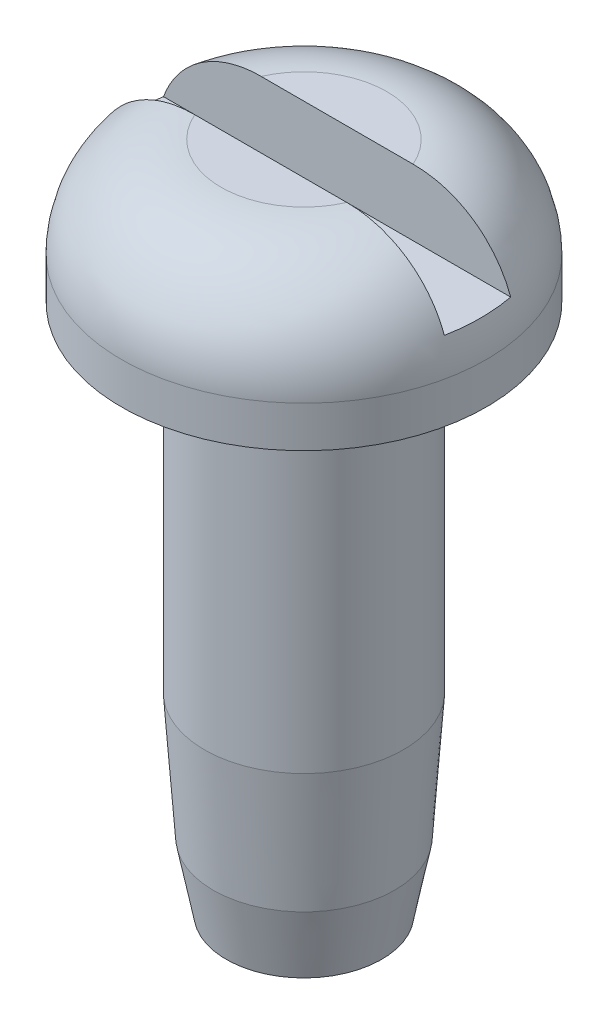
ISO-10303-21;
HEADER;
FILE_DESCRIPTION(('STEP AP214'),'2;1');
FILE_NAME('part.step','',(''),(''),'','','');
FILE_SCHEMA(('AUTOMOTIVE_DESIGN { 1 0 10303 214 1 1 1 1 }'));
ENDSEC;
DATA;
#1=APPLICATION_CONTEXT('core data for automotive mechanical design processes');
#2=APPLICATION_PROTOCOL_DEFINITION('international standard','automotive_design',2000,#1);
#3=PRODUCT_CONTEXT('',#1,'mechanical');
#4=PRODUCT('Part','Part','',(#3));
#5=PRODUCT_RELATED_PRODUCT_CATEGORY('part','',(#4));
#6=PRODUCT_DEFINITION_FORMATION('','',#4);
#7=PRODUCT_DEFINITION_CONTEXT('part definition',#1,'design');
#8=PRODUCT_DEFINITION('design','',#6,#7);
#9=PRODUCT_DEFINITION_SHAPE('','',#8);
#10=(LENGTH_UNIT() NAMED_UNIT(*) SI_UNIT(.MILLI.,.METRE.));
#11=(NAMED_UNIT(*) PLANE_ANGLE_UNIT() SI_UNIT($,.RADIAN.));
#12=(NAMED_UNIT(*) SI_UNIT($,.STERADIAN.) SOLID_ANGLE_UNIT());
#13=UNCERTAINTY_MEASURE_WITH_UNIT(LENGTH_MEASURE(1.E-05),#10,'distance_accuracy_value','');
#14=(GEOMETRIC_REPRESENTATION_CONTEXT(3) GLOBAL_UNCERTAINTY_ASSIGNED_CONTEXT((#13)) GLOBAL_UNIT_ASSIGNED_CONTEXT((#10,
#11,#12)) REPRESENTATION_CONTEXT('',''));
#15=CARTESIAN_POINT('',(0.,0.,0.));
#16=DIRECTION('',(0.,0.,1.));
#17=DIRECTION('',(1.,0.,0.));
#18=AXIS2_PLACEMENT_3D('',#15,#16,#17);
#19=CARTESIAN_POINT('',(0.,10.12,0.));
#20=DIRECTION('',(0.,1.,0.));
#21=DIRECTION('',(0.,0.,1.));
#22=AXIS2_PLACEMENT_3D('',#19,#20,#21);
#23=PLANE('',#22);
#24=DIRECTION('',(1.,0.,0.));
#25=VECTOR('',#24,1.);
#26=CARTESIAN_POINT('',(-5.,10.12,0.5));
#27=LINE('',#26,#25);
#28=CARTESIAN_POINT('',(-1.14564392373896,10.12,0.5));
#29=VERTEX_POINT('',#28);
#30=CARTESIAN_POINT('',(1.14564392373896,10.12,0.5));
#31=VERTEX_POINT('',#30);
#32=EDGE_CURVE('E55',#29,#31,#27,.T.);
#33=ORIENTED_EDGE('',*,*,#32,.F.);
#34=CARTESIAN_POINT('',(0.,10.12,0.));
#35=DIRECTION('',(0.,-1.,0.));
#36=DIRECTION('',(0.,0.,-1.));
#37=AXIS2_PLACEMENT_3D('',#34,#35,#36);
#38=CIRCLE('',#37,1.25);
#39=EDGE_CURVE('E89',#31,#29,#38,.T.);
#40=ORIENTED_EDGE('',*,*,#39,.F.);
#41=EDGE_LOOP('',(#33,#40));
#42=FACE_BOUND('',#41,.T.);
#43=ADVANCED_FACE('F29',(#42),#23,.T.);
#44=CARTESIAN_POINT('',(1.17275874816961,0.,0.));
#45=DIRECTION('',(0.,-1.,0.));
#46=DIRECTION('',(0.,0.,-1.));
#47=AXIS2_PLACEMENT_3D('',#44,#45,#46);
#48=PLANE('',#47);
#49=CARTESIAN_POINT('',(0.,0.,0.));
#50=DIRECTION('',(0.,-1.,0.));
#51=DIRECTION('',(0.,0.,-1.));
#52=AXIS2_PLACEMENT_3D('',#49,#50,#51);
#53=CIRCLE('',#52,1.17275874816961);
#54=CARTESIAN_POINT('',(0.,0.,-1.17275874816961));
#55=VERTEX_POINT('',#54);
#56=EDGE_CURVE('E153',#55,#55,#53,.T.);
#57=ORIENTED_EDGE('',*,*,#56,.T.);
#58=EDGE_LOOP('',(#57));
#59=FACE_BOUND('',#58,.T.);
#60=ADVANCED_FACE('F31',(#59),#48,.T.);
#61=DIRECTION('',(1.,0.,0.));
#62=VECTOR('',#61,1.);
#63=CARTESIAN_POINT('',(-5.,10.12,-0.5));
#64=LINE('',#63,#62);
#65=CARTESIAN_POINT('',(-1.14564392373894,10.12,-0.5));
#66=VERTEX_POINT('',#65);
#67=CARTESIAN_POINT('',(1.14564392373896,10.12,-0.5));
#68=VERTEX_POINT('',#67);
#69=EDGE_CURVE('E147',#66,#68,#64,.T.);
#70=ORIENTED_EDGE('',*,*,#69,.T.);
#71=EDGE_CURVE('E91',#66,#68,#38,.T.);
#72=ORIENTED_EDGE('',*,*,#71,.F.);
#73=EDGE_LOOP('',(#70,#72));
#74=FACE_BOUND('',#73,.T.);
#75=ADVANCED_FACE('F134',(#74),#23,.T.);
#76=CARTESIAN_POINT('',(0.,8.62,0.));
#77=DIRECTION('',(0.,-1.,0.));
#78=DIRECTION('',(0.,0.,-1.));
#79=AXIS2_PLACEMENT_3D('',#76,#77,#78);
#80=DEGENERATE_TOROIDAL_SURFACE('',#79,1.25,1.5,.T.);
#81=CARTESIAN_POINT('',(0.,9.91903810567666,0.5));
#82=CARTESIAN_POINT('',(0.0197737967426219,9.91903699051281,0.5));
#83=CARTESIAN_POINT('',(0.039545997070024,9.91972097422772,0.5));
#84=CARTESIAN_POINT('',(0.0790049364274311,9.92238565184631,0.5));
#85=CARTESIAN_POINT('',(0.0986916568827287,9.92436661465185,0.5));
#86=CARTESIAN_POINT('',(0.157658806665077,9.93201772190164,0.5));
#87=CARTESIAN_POINT('',(0.196712342215652,9.93939416178655,0.5));
#88=CARTESIAN_POINT('',(0.275124136138794,9.95691867254126,0.5));
#89=CARTESIAN_POINT('',(0.314466933281958,9.96712944240033,0.5));
#90=CARTESIAN_POINT('',(0.39287139062671,9.98839358731296,0.5));
#91=CARTESIAN_POINT('',(0.431933305028928,9.99944605597856,0.5));
#92=CARTESIAN_POINT('',(0.501301872096742,10.0187136890993,0.5));
#93=CARTESIAN_POINT('',(0.531587016560786,10.0270043381932,0.5));
#94=CARTESIAN_POINT('',(0.59231873710385,10.0429681170111,0.5));
#95=CARTESIAN_POINT('',(0.622765307602736,10.0506412679342,0.5));
#96=CARTESIAN_POINT('',(0.714444507837876,10.072268731735,0.5));
#97=CARTESIAN_POINT('',(0.77602264255314,10.0848328671731,0.5));
#98=CARTESIAN_POINT('',(0.899211926418849,10.1045063690872,0.5));
#99=CARTESIAN_POINT('',(0.960811009545612,10.1116882742655,0.5));
#100=CARTESIAN_POINT('',(1.08441181623602,10.119982708445,0.5));
#101=CARTESIAN_POINT('',(1.14641345705493,10.1210964475224,0.5));
#102=CARTESIAN_POINT('',(1.29839149729664,10.1156808031107,0.5));
#103=CARTESIAN_POINT('',(1.38827496423116,10.1054476264636,0.5));
#104=CARTESIAN_POINT('',(1.5655160441354,10.0701085255421,0.5));
#105=CARTESIAN_POINT('',(1.65286037456457,10.0449354557139,0.5));
#106=CARTESIAN_POINT('',(1.82201022944715,9.97980320122016,0.5));
#107=CARTESIAN_POINT('',(1.90380863536467,9.93982542352841,0.5));
#108=CARTESIAN_POINT('',(2.05893063453845,9.84606037380876,0.5));
#109=CARTESIAN_POINT('',(2.13226621782682,9.79229299585723,0.5));
#110=CARTESIAN_POINT('',(2.26478412131533,9.67539956584984,0.5));
#111=CARTESIAN_POINT('',(2.32448197727165,9.61285721966374,0.5));
#112=CARTESIAN_POINT('',(2.43222659686663,9.47840118755471,0.5));
#113=CARTESIAN_POINT('',(2.48027148226754,9.40648599377457,0.5));
#114=CARTESIAN_POINT('',(2.56214623761733,9.25728685626811,0.5));
#115=CARTESIAN_POINT('',(2.59629751819339,9.18017910279185,0.5));
#116=CARTESIAN_POINT('',(2.6510201495019,9.02129400062946,0.5));
#117=CARTESIAN_POINT('',(2.67159356246283,8.93951736311187,0.5));
#118=CARTESIAN_POINT('',(2.69840777421314,8.77448124410096,0.5));
#119=CARTESIAN_POINT('',(2.70478844563198,8.69124445683348,0.5));
#120=CARTESIAN_POINT('',(2.70344187908911,8.52488375286552,0.5));
#121=CARTESIAN_POINT('',(2.69571462174529,8.44175983632027,0.5));
#122=CARTESIAN_POINT('',(2.6664238938936,8.2782303265959,0.5));
#123=CARTESIAN_POINT('',(2.64489941267322,8.19781774341545,0.5));
#124=CARTESIAN_POINT('',(2.58868989599857,8.04173685310368,0.5));
#125=CARTESIAN_POINT('',(2.55400522221295,7.96606841566025,0.5));
#126=CARTESIAN_POINT('',(2.47239136730437,7.82139313741305,0.5));
#127=CARTESIAN_POINT('',(2.42543044004134,7.75240421302385,0.5));
#128=CARTESIAN_POINT('',(2.32068991297136,7.62320055409526,0.5));
#129=CARTESIAN_POINT('',(2.26290986909631,7.56298617988569,0.5));
#130=CARTESIAN_POINT('',(2.1376383937126,7.4524066505661,0.5));
#131=CARTESIAN_POINT('',(2.07006224255004,7.4021375411874,0.5));
#132=CARTESIAN_POINT('',(1.92756642032558,7.31338415072852,0.5));
#133=CARTESIAN_POINT('',(1.85264537322231,7.2749020835018,0.5));
#134=CARTESIAN_POINT('',(1.69586550119496,7.20979556853511,0.5));
#135=CARTESIAN_POINT('',(1.61388894691269,7.18345572003334,0.5));
#136=CARTESIAN_POINT('',(1.44689684836527,7.14422598061919,0.5));
#137=CARTESIAN_POINT('',(1.36188552335867,7.13131811481953,0.5));
#138=CARTESIAN_POINT('',(1.23157222453163,7.12149658917173,0.5));
#139=CARTESIAN_POINT('',(1.18656268644896,7.1199004182258,0.5));
#140=CARTESIAN_POINT('',(1.09652167613938,7.12010899856503,0.5));
#141=CARTESIAN_POINT('',(1.05149020479393,7.12191553458151,0.5));
#142=CARTESIAN_POINT('',(0.961325647015333,7.12872615390305,0.5));
#143=CARTESIAN_POINT('',(0.91619450842239,7.13375507198137,0.5));
#144=CARTESIAN_POINT('',(0.826423033823089,7.14667162268328,0.5));
#145=CARTESIAN_POINT('',(0.781782036842491,7.15455474106898,0.5));
#146=CARTESIAN_POINT('',(0.704511960096931,7.1703213912584,0.5));
#147=CARTESIAN_POINT('',(0.671771535042426,7.17767410717229,0.5));
#148=CARTESIAN_POINT('',(0.606531309085661,7.19338310482878,0.5));
#149=CARTESIAN_POINT('',(0.574031532385124,7.20173948609176,0.5));
#150=CARTESIAN_POINT('',(0.509026602822168,7.21911881844639,0.5));
#151=CARTESIAN_POINT('',(0.476522363264104,7.22814511639375,0.5));
#152=CARTESIAN_POINT('',(0.411540765901529,7.24628508113241,0.5));
#153=CARTESIAN_POINT('',(0.379063406725101,7.25539874312239,0.5));
#154=CARTESIAN_POINT('',(0.314811102196065,7.27271929870446,0.5));
#155=CARTESIAN_POINT('',(0.283041154127009,7.2809441425563,0.5));
#156=CARTESIAN_POINT('',(0.219122271479169,7.29581576847306,0.5));
#157=CARTESIAN_POINT('',(0.186973413174861,7.3024628626301,0.5));
#158=CARTESIAN_POINT('',(0.122535986915505,7.31299574174243,0.5));
#159=CARTESIAN_POINT('',(0.0902522633560652,7.31690924568899,0.5));
#160=CARTESIAN_POINT('',(0.0254565220278628,7.3211738697098,0.5));
#161=CARTESIAN_POINT('',(-0.00705527487153956,7.32152805879707,0.5));
#162=CARTESIAN_POINT('',(-0.0641114600706277,7.31895294789521,0.5));
#163=CARTESIAN_POINT('',(-0.0886952199397869,7.3167913357537,0.5));
#164=CARTESIAN_POINT('',(-0.1376461288443,7.31069149052012,0.5));
#165=CARTESIAN_POINT('',(-0.162013161098763,7.30675235253672,0.5));
#166=CARTESIAN_POINT('',(-0.210680764188104,7.29751931696451,0.5));
#167=CARTESIAN_POINT('',(-0.234979261882854,7.29221488458718,0.5));
#168=CARTESIAN_POINT('',(-0.283365005670842,7.28074448060725,0.5));
#169=CARTESIAN_POINT('',(-0.307452266115815,7.2745785680243,0.5));
#170=CARTESIAN_POINT('',(-0.380779475434894,7.25510624869801,0.5));
#171=CARTESIAN_POINT('',(-0.429830363167437,7.2411101050747,0.5));
#172=CARTESIAN_POINT('',(-0.527981941469721,7.21390980279642,0.5));
#173=CARTESIAN_POINT('',(-0.57708193114663,7.20070317855707,0.5));
#174=CARTESIAN_POINT('',(-0.675177152279307,7.1766798462992,0.5));
#175=CARTESIAN_POINT('',(-0.724164766426272,7.16583314340996,0.5));
#176=CARTESIAN_POINT('',(-0.822717908206681,7.14722410901175,0.5));
#177=CARTESIAN_POINT('',(-0.872283220881641,7.13946066572114,0.5));
#178=CARTESIAN_POINT('',(-0.971461809580802,7.12766653719701,0.5));
#179=CARTESIAN_POINT('',(-1.0210714167357,7.12360600589815,0.5));
#180=CARTESIAN_POINT('',(-1.12043682002785,7.1195016985067,0.5));
#181=CARTESIAN_POINT('',(-1.17019256864058,7.11945673596021,0.5));
#182=CARTESIAN_POINT('',(-1.31007808547006,7.1253755312838,0.5));
#183=CARTESIAN_POINT('',(-1.40006528318003,7.13626602026124,0.5));
#184=CARTESIAN_POINT('',(-1.57714690188035,7.17294138560288,0.5));
#185=CARTESIAN_POINT('',(-1.66423528139452,7.1987555318006,0.5));
#186=CARTESIAN_POINT('',(-1.83282513983102,7.26514806806966,0.5));
#187=CARTESIAN_POINT('',(-1.91431523553662,7.30575554004196,0.5));
#188=CARTESIAN_POINT('',(-2.0687843392629,7.40077311982285,0.5));
#189=CARTESIAN_POINT('',(-2.14176691627206,7.45517740909185,0.5));
#190=CARTESIAN_POINT('',(-2.2733629164777,7.57316004046121,0.5));
#191=CARTESIAN_POINT('',(-2.33251475259027,7.63613866059503,0.5));
#192=CARTESIAN_POINT('',(-2.43908695339319,7.77134153361864,0.5));
#193=CARTESIAN_POINT('',(-2.48650928065704,7.84356423672181,0.5));
#194=CARTESIAN_POINT('',(-2.56714602079698,7.99329987399692,0.5));
#195=CARTESIAN_POINT('',(-2.60067501661592,8.07064357513314,0.5));
#196=CARTESIAN_POINT('',(-2.65412847292476,8.22989815682363,0.5));
#197=CARTESIAN_POINT('',(-2.6740536972842,8.31180878065979,0.5));
#198=CARTESIAN_POINT('',(-2.69957055354835,8.47701492711504,0.5));
#199=CARTESIAN_POINT('',(-2.70529958425244,8.56028925853129,0.5));
#200=CARTESIAN_POINT('',(-2.70265446610113,8.72661224981365,0.5));
#201=CARTESIAN_POINT('',(-2.69428074156518,8.80966091639421,0.5));
#202=CARTESIAN_POINT('',(-2.66372171104013,8.97294378541415,0.5));
#203=CARTESIAN_POINT('',(-2.64157356642372,9.05318494886326,0.5));
#204=CARTESIAN_POINT('',(-2.58415506988989,9.20882500017115,0.5));
#205=CARTESIAN_POINT('',(-2.54888454434441,9.28422382394331,0.5));
#206=CARTESIAN_POINT('',(-2.46614594655662,9.42827883747408,0.5));
#207=CARTESIAN_POINT('',(-2.41864421566047,9.496915686834,0.5));
#208=CARTESIAN_POINT('',(-2.3128961436133,9.62532359557806,0.5));
#209=CARTESIAN_POINT('',(-2.25465066655872,9.68509536726438,0.5));
#210=CARTESIAN_POINT('',(-2.12852249718834,9.79472330200188,0.5));
#211=CARTESIAN_POINT('',(-2.06055517165249,9.84448202251315,0.5));
#212=CARTESIAN_POINT('',(-1.91734454137423,9.93218062286367,0.5));
#213=CARTESIAN_POINT('',(-1.84209723549368,9.9701139544596,0.5));
#214=CARTESIAN_POINT('',(-1.68469744675869,10.0340953760603,0.5));
#215=CARTESIAN_POINT('',(-1.60242569324102,10.059849018064,0.5));
#216=CARTESIAN_POINT('',(-1.435027547044,10.0978610722488,0.5));
#217=CARTESIAN_POINT('',(-1.34990795382501,10.1101495523996,0.5));
#218=CARTESIAN_POINT('',(-1.20921514067648,10.1197516036337,0.5));
#219=CARTESIAN_POINT('',(-1.15385942116029,10.1208284030323,0.5));
#220=CARTESIAN_POINT('',(-1.0432566354532,10.117938218697,0.5));
#221=CARTESIAN_POINT('',(-0.988009623722295,10.1139691469865,0.5));
#222=CARTESIAN_POINT('',(-0.877454898241028,10.1014296281703,0.5));
#223=CARTESIAN_POINT('',(-0.82215298947621,10.0928098832048,0.5));
#224=CARTESIAN_POINT('',(-0.7123401251258,10.0717770638322,0.5));
#225=CARTESIAN_POINT('',(-0.657828617837623,10.0593667833989,0.5));
#226=CARTESIAN_POINT('',(-0.553004651572941,10.0329701863767,0.5));
#227=CARTESIAN_POINT('',(-0.50265091655735,10.0191402275373,0.5));
#228=CARTESIAN_POINT('',(-0.401924906144861,9.99103689280184,0.5));
#229=CARTESIAN_POINT('',(-0.351552913771802,9.97676247163309,0.5));
#230=CARTESIAN_POINT('',(-0.276142022207293,9.95749613532875,0.5));
#231=CARTESIAN_POINT('',(-0.251369522605792,9.95150008685695,0.5));
#232=CARTESIAN_POINT('',(-0.201572089139234,9.94063565657851,0.5));
#233=CARTESIAN_POINT('',(-0.176547167739648,9.93576721936826,0.5));
#234=CARTESIAN_POINT('',(-0.126355625524987,9.92770226773487,0.5));
#235=CARTESIAN_POINT('',(-0.101190474849764,9.92449696460789,0.5));
#236=CARTESIAN_POINT('',(-0.0506826207314979,9.92016605140756,0.5));
#237=CARTESIAN_POINT('',(-0.0253399995280062,9.91903953475231,0.5));
#238=CARTESIAN_POINT('',(0.,9.91903810567666,0.5));
#239=B_SPLINE_CURVE_WITH_KNOTS('',3,(#81,#82,#83,#84,#85,#86,#87,#88,#89,#90,#91,#92,#93,#94,
#95,#96,#97,#98,#99,#100,#101,#102,#103,#104,#105,#106,#107,#108,#109,#110,#111,#112,#113,#114,
#115,#116,#117,#118,#119,#120,#121,#122,#123,#124,#125,#126,#127,#128,#129,#130,#131,#132,#133,
#134,#135,#136,#137,#138,#139,#140,#141,#142,#143,#144,#145,#146,#147,#148,#149,#150,#151,#152,
#153,#154,#155,#156,#157,#158,#159,#160,#161,#162,#163,#164,#165,#166,#167,#168,#169,#170,#171,
#172,#173,#174,#175,#176,#177,#178,#179,#180,#181,#182,#183,#184,#185,#186,#187,#188,#189,#190,
#191,#192,#193,#194,#195,#196,#197,#198,#199,#200,#201,#202,#203,#204,#205,#206,#207,#208,#209,
#210,#211,#212,#213,#214,#215,#216,#217,#218,#219,#220,#221,#222,#223,#224,#225,#226,#227,#228,
#229,#230,#231,#232,#233,#234,#235,#236,#237,#238),.UNSPECIFIED.,.T.,.F.,(4,2,2,2,2,2,2,2,2,2,2,
2,2,2,2,2,2,2,2,2,2,2,2,2,2,2,2,2,2,2,2,2,2,2,2,2,2,2,2,2,2,2,2,2,2,2,2,2,2,2,2,2,2,2,2,2,2,2,2,
2,2,2,2,2,2,2,2,2,2,2,2,2,2,2,2,2,2,2,4),(0.,0.0593076634889018,0.118627627094602,
0.237666401603138,0.359583225739831,0.48137057067017,0.575564762302632,0.66975571881199,
0.858118806027022,1.04389518048997,1.22963450721934,1.4997908255925,1.77117062309283,
2.04289240496523,2.3142243611401,2.57233466475584,2.83048654324964,3.08227053978,
3.33401628614395,3.58326981923221,3.83252369475662,4.08107629567917,4.329622066369,
4.57881704117945,4.82802224638251,5.07952778846577,5.3310805396336,5.58826214142042,
5.84509913447087,5.98010333657349,6.1151783685559,6.25130714834008,6.38722155903232,
6.48787091567203,6.58853026064626,6.68973160337025,6.79092741584212,6.88936359709383,
6.98778029058653,7.08518394101472,7.18250359810175,7.25646491957285,7.33046393534475,
7.40505201146823,7.47963498009665,7.63265649956172,7.78517207413612,7.93561833968183,
8.08601030698006,8.23517909210656,8.38430380315934,8.65495923778651,8.92614731972606,
9.19787142742351,9.46948113077632,9.72741738270311,9.98531044767135,10.2369944418546,
10.4886643024902,10.7378886758483,10.9871055507525,11.2356529742415,11.484203686489,
11.7334458265571,11.9826679293487,12.2342091021297,12.4858893180271,12.7433770223408,
13.000288572397,13.1661692931842,13.3321186776024,13.4998627393571,13.6674834554572,
13.8241310791753,13.9811800408005,14.0576275577146,14.1340713176885,14.210106893345,
14.286109301197),.UNSPECIFIED.);
#240=CARTESIAN_POINT('',(-2.61687483574067,9.12,0.5));
#241=VERTEX_POINT('',#240);
#242=EDGE_CURVE('E11',#241,#29,#239,.T.);
#243=ORIENTED_EDGE('',*,*,#242,.F.);
#244=CARTESIAN_POINT('',(0.,9.12,0.));
#245=DIRECTION('',(0.,-1.,0.));
#246=DIRECTION('',(0.,0.,-1.));
#247=AXIS2_PLACEMENT_3D('',#244,#245,#246);
#248=CIRCLE('',#247,2.66421356237309);
#249=CARTESIAN_POINT('',(-2.61687483574067,9.12,-0.5));
#250=VERTEX_POINT('',#249);
#251=EDGE_CURVE('E73',#250,#241,#248,.F.);
#252=ORIENTED_EDGE('',*,*,#251,.F.);
#253=CARTESIAN_POINT('',(0.,9.91903810567666,-0.5));
#254=CARTESIAN_POINT('',(-0.0197737967426219,9.91903699051281,-0.5));
#255=CARTESIAN_POINT('',(-0.039545997070024,9.91972097422772,-0.5));
#256=CARTESIAN_POINT('',(-0.0790049364274312,9.92238565184631,-0.5));
#257=CARTESIAN_POINT('',(-0.0986916568827288,9.92436661465185,-0.5));
#258=CARTESIAN_POINT('',(-0.157658806665077,9.93201772190164,-0.5));
#259=CARTESIAN_POINT('',(-0.196712342215652,9.93939416178655,-0.5));
#260=CARTESIAN_POINT('',(-0.275124136138794,9.95691867254126,-0.5));
#261=CARTESIAN_POINT('',(-0.314466933281957,9.96712944240033,-0.5));
#262=CARTESIAN_POINT('',(-0.39287139062671,9.98839358731296,-0.5));
#263=CARTESIAN_POINT('',(-0.431933305028928,9.99944605597856,-0.5));
#264=CARTESIAN_POINT('',(-0.501301872096742,10.0187136890993,-0.5));
#265=CARTESIAN_POINT('',(-0.531587016560786,10.0270043381932,-0.5));
#266=CARTESIAN_POINT('',(-0.592318737103849,10.0429681170111,-0.5));
#267=CARTESIAN_POINT('',(-0.622765307602736,10.0506412679342,-0.5));
#268=CARTESIAN_POINT('',(-0.714444507837876,10.072268731735,-0.5));
#269=CARTESIAN_POINT('',(-0.77602264255314,10.0848328671731,-0.5));
#270=CARTESIAN_POINT('',(-0.899211926418849,10.1045063690872,-0.5));
#271=CARTESIAN_POINT('',(-0.960811009545612,10.1116882742655,-0.5));
#272=CARTESIAN_POINT('',(-1.08441181623602,10.119982708445,-0.5));
#273=CARTESIAN_POINT('',(-1.14641345705493,10.1210964475224,-0.5));
#274=CARTESIAN_POINT('',(-1.29839149729664,10.1156808031107,-0.5));
#275=CARTESIAN_POINT('',(-1.38827496423116,10.1054476264636,-0.5));
#276=CARTESIAN_POINT('',(-1.5655160441354,10.0701085255421,-0.5));
#277=CARTESIAN_POINT('',(-1.65286037456457,10.0449354557139,-0.5));
#278=CARTESIAN_POINT('',(-1.82201022944715,9.97980320122016,-0.5));
#279=CARTESIAN_POINT('',(-1.90380863536468,9.93982542352841,-0.5));
#280=CARTESIAN_POINT('',(-2.05893063453845,9.84606037380876,-0.5));
#281=CARTESIAN_POINT('',(-2.13226621782682,9.79229299585723,-0.5));
#282=CARTESIAN_POINT('',(-2.26478412131533,9.67539956584984,-0.5));
#283=CARTESIAN_POINT('',(-2.32448197727165,9.61285721966374,-0.5));
#284=CARTESIAN_POINT('',(-2.43222659686663,9.47840118755471,-0.5));
#285=CARTESIAN_POINT('',(-2.48027148226754,9.40648599377457,-0.5));
#286=CARTESIAN_POINT('',(-2.56214623761733,9.25728685626811,-0.5));
#287=CARTESIAN_POINT('',(-2.59629751819339,9.18017910279185,-0.5));
#288=CARTESIAN_POINT('',(-2.6510201495019,9.02129400062946,-0.5));
#289=CARTESIAN_POINT('',(-2.67159356246283,8.93951736311187,-0.5));
#290=CARTESIAN_POINT('',(-2.69840777421314,8.77448124410096,-0.5));
#291=CARTESIAN_POINT('',(-2.70478844563198,8.69124445683348,-0.5));
#292=CARTESIAN_POINT('',(-2.70344187908911,8.52488375286552,-0.5));
#293=CARTESIAN_POINT('',(-2.69571462174529,8.44175983632027,-0.5));
#294=CARTESIAN_POINT('',(-2.6664238938936,8.2782303265959,-0.5));
#295=CARTESIAN_POINT('',(-2.64489941267322,8.19781774341545,-0.500000000000001));
#296=CARTESIAN_POINT('',(-2.58868989599857,8.04173685310368,-0.500000000000001));
#297=CARTESIAN_POINT('',(-2.55400522221295,7.96606841566025,-0.500000000000001));
#298=CARTESIAN_POINT('',(-2.47239136730437,7.82139313741305,-0.500000000000001));
#299=CARTESIAN_POINT('',(-2.42543044004134,7.75240421302385,-0.500000000000001));
#300=CARTESIAN_POINT('',(-2.32068991297137,7.62320055409526,-0.500000000000001));
#301=CARTESIAN_POINT('',(-2.26290986909631,7.56298617988569,-0.500000000000001));
#302=CARTESIAN_POINT('',(-2.1376383937126,7.4524066505661,-0.500000000000001));
#303=CARTESIAN_POINT('',(-2.07006224255004,7.4021375411874,-0.500000000000001));
#304=CARTESIAN_POINT('',(-1.92756642032558,7.31338415072853,-0.500000000000001));
#305=CARTESIAN_POINT('',(-1.85264537322232,7.2749020835018,-0.500000000000001));
#306=CARTESIAN_POINT('',(-1.69586550119496,7.20979556853511,-0.500000000000001));
#307=CARTESIAN_POINT('',(-1.61388894691269,7.18345572003334,-0.500000000000001));
#308=CARTESIAN_POINT('',(-1.44689684836527,7.14422598061919,-0.500000000000001));
#309=CARTESIAN_POINT('',(-1.36188552335867,7.13131811481953,-0.500000000000001));
#310=CARTESIAN_POINT('',(-1.23157222453163,7.12149658917173,-0.500000000000001));
#311=CARTESIAN_POINT('',(-1.18656268644896,7.1199004182258,-0.500000000000001));
#312=CARTESIAN_POINT('',(-1.09652167613938,7.12010899856503,-0.500000000000001));
#313=CARTESIAN_POINT('',(-1.05149020479393,7.12191553458151,-0.500000000000001));
#314=CARTESIAN_POINT('',(-0.961325647015334,7.12872615390304,-0.500000000000001));
#315=CARTESIAN_POINT('',(-0.916194508422391,7.13375507198137,-0.500000000000001));
#316=CARTESIAN_POINT('',(-0.826423033823089,7.14667162268328,-0.500000000000001));
#317=CARTESIAN_POINT('',(-0.781782036842492,7.15455474106898,-0.500000000000001));
#318=CARTESIAN_POINT('',(-0.704511960096931,7.1703213912584,-0.500000000000001));
#319=CARTESIAN_POINT('',(-0.671771535042427,7.17767410717229,-0.500000000000001));
#320=CARTESIAN_POINT('',(-0.606531309085662,7.19338310482878,-0.500000000000001));
#321=CARTESIAN_POINT('',(-0.574031532385124,7.20173948609176,-0.500000000000001));
#322=CARTESIAN_POINT('',(-0.509026602822168,7.21911881844639,-0.500000000000001));
#323=CARTESIAN_POINT('',(-0.476522363264104,7.22814511639375,-0.500000000000001));
#324=CARTESIAN_POINT('',(-0.41154076590153,7.24628508113241,-0.500000000000001));
#325=CARTESIAN_POINT('',(-0.379063406725102,7.25539874312239,-0.500000000000001));
#326=CARTESIAN_POINT('',(-0.314811102196065,7.27271929870446,-0.500000000000001));
#327=CARTESIAN_POINT('',(-0.283041154127009,7.2809441425563,-0.500000000000001));
#328=CARTESIAN_POINT('',(-0.219122271479168,7.29581576847306,-0.500000000000001));
#329=CARTESIAN_POINT('',(-0.186973413174861,7.3024628626301,-0.500000000000001));
#330=CARTESIAN_POINT('',(-0.122535986915504,7.31299574174243,-0.500000000000001));
#331=CARTESIAN_POINT('',(-0.0902522633560639,7.31690924568899,-0.500000000000001));
#332=CARTESIAN_POINT('',(-0.0254565220278613,7.3211738697098,-0.500000000000001));
#333=CARTESIAN_POINT('',(0.00705527487154105,7.32152805879706,-0.500000000000001));
#334=CARTESIAN_POINT('',(0.0641114600706295,7.31895294789521,-0.500000000000001));
#335=CARTESIAN_POINT('',(0.088695219939789,7.3167913357537,-0.500000000000001));
#336=CARTESIAN_POINT('',(0.137646128844303,7.31069149052012,-0.500000000000001));
#337=CARTESIAN_POINT('',(0.162013161098766,7.30675235253672,-0.500000000000001));
#338=CARTESIAN_POINT('',(0.210680764188108,7.2975193169645,-0.500000000000001));
#339=CARTESIAN_POINT('',(0.234979261882858,7.29221488458718,-0.500000000000001));
#340=CARTESIAN_POINT('',(0.283365005670846,7.28074448060725,-0.500000000000001));
#341=CARTESIAN_POINT('',(0.30745226611582,7.2745785680243,-0.500000000000001));
#342=CARTESIAN_POINT('',(0.380779475434901,7.255106248698,-0.500000000000001));
#343=CARTESIAN_POINT('',(0.429830363167444,7.2411101050747,-0.500000000000001));
#344=CARTESIAN_POINT('',(0.52798194146973,7.21390980279642,-0.500000000000001));
#345=CARTESIAN_POINT('',(0.57708193114664,7.20070317855707,-0.500000000000001));
#346=CARTESIAN_POINT('',(0.675177152279318,7.1766798462992,-0.500000000000001));
#347=CARTESIAN_POINT('',(0.724164766426284,7.16583314340995,-0.500000000000001));
#348=CARTESIAN_POINT('',(0.822717908206695,7.14722410901175,-0.500000000000001));
#349=CARTESIAN_POINT('',(0.872283220881655,7.13946066572113,-0.500000000000001));
#350=CARTESIAN_POINT('',(0.971461809580818,7.12766653719701,-0.500000000000001));
#351=CARTESIAN_POINT('',(1.02107141673572,7.12360600589815,-0.500000000000001));
#352=CARTESIAN_POINT('',(1.12043682002787,7.1195016985067,-0.500000000000001));
#353=CARTESIAN_POINT('',(1.1701925686406,7.11945673596021,-0.500000000000001));
#354=CARTESIAN_POINT('',(1.31007808547008,7.1253755312838,-0.500000000000001));
#355=CARTESIAN_POINT('',(1.40006528318005,7.13626602026124,-0.500000000000001));
#356=CARTESIAN_POINT('',(1.57714690188037,7.17294138560289,-0.500000000000001));
#357=CARTESIAN_POINT('',(1.66423528139454,7.19875553180061,-0.500000000000001));
#358=CARTESIAN_POINT('',(1.83282513983103,7.26514806806967,-0.500000000000001));
#359=CARTESIAN_POINT('',(1.91431523553664,7.30575554004197,-0.500000000000001));
#360=CARTESIAN_POINT('',(2.06878433926292,7.40077311982286,-0.500000000000001));
#361=CARTESIAN_POINT('',(2.14176691627208,7.45517740909186,-0.500000000000001));
#362=CARTESIAN_POINT('',(2.27336291647772,7.57316004046123,-0.500000000000001));
#363=CARTESIAN_POINT('',(2.33251475259028,7.63613866059504,-0.500000000000001));
#364=CARTESIAN_POINT('',(2.4390869533932,7.77134153361865,-0.500000000000001));
#365=CARTESIAN_POINT('',(2.48650928065705,7.84356423672183,-0.500000000000001));
#366=CARTESIAN_POINT('',(2.56714602079698,7.99329987399693,-0.500000000000001));
#367=CARTESIAN_POINT('',(2.60067501661592,8.07064357513316,-0.500000000000001));
#368=CARTESIAN_POINT('',(2.65412847292476,8.22989815682364,-0.500000000000001));
#369=CARTESIAN_POINT('',(2.67405369728421,8.31180878065981,-0.5));
#370=CARTESIAN_POINT('',(2.69957055354835,8.47701492711506,-0.5));
#371=CARTESIAN_POINT('',(2.70529958425244,8.5602892585313,-0.5));
#372=CARTESIAN_POINT('',(2.70265446610113,8.72661224981367,-0.5));
#373=CARTESIAN_POINT('',(2.69428074156518,8.80966091639422,-0.5));
#374=CARTESIAN_POINT('',(2.66372171104012,8.97294378541417,-0.5));
#375=CARTESIAN_POINT('',(2.64157356642371,9.05318494886328,-0.5));
#376=CARTESIAN_POINT('',(2.58415506988988,9.20882500017117,-0.5));
#377=CARTESIAN_POINT('',(2.54888454434441,9.28422382394332,-0.5));
#378=CARTESIAN_POINT('',(2.46614594655661,9.42827883747409,-0.5));
#379=CARTESIAN_POINT('',(2.41864421566046,9.49691568683402,-0.5));
#380=CARTESIAN_POINT('',(2.31289614361329,9.62532359557807,-0.5));
#381=CARTESIAN_POINT('',(2.25465066655871,9.68509536726439,-0.5));
#382=CARTESIAN_POINT('',(2.12852249718833,9.79472330200189,-0.5));
#383=CARTESIAN_POINT('',(2.06055517165248,9.84448202251316,-0.5));
#384=CARTESIAN_POINT('',(1.91734454137422,9.93218062286367,-0.5));
#385=CARTESIAN_POINT('',(1.84209723549366,9.97011395445961,-0.5));
#386=CARTESIAN_POINT('',(1.68469744675868,10.0340953760603,-0.5));
#387=CARTESIAN_POINT('',(1.60242569324101,10.059849018064,-0.5));
#388=CARTESIAN_POINT('',(1.43502754704399,10.0978610722488,-0.5));
#389=CARTESIAN_POINT('',(1.34990795382499,10.1101495523996,-0.5));
#390=CARTESIAN_POINT('',(1.20921514067647,10.1197516036337,-0.5));
#391=CARTESIAN_POINT('',(1.15385942116027,10.1208284030323,-0.5));
#392=CARTESIAN_POINT('',(1.04325663545318,10.117938218697,-0.5));
#393=CARTESIAN_POINT('',(0.988009623722275,10.1139691469865,-0.5));
#394=CARTESIAN_POINT('',(0.877454898241008,10.1014296281703,-0.5));
#395=CARTESIAN_POINT('',(0.822152989476189,10.0928098832048,-0.5));
#396=CARTESIAN_POINT('',(0.712340125125777,10.0717770638322,-0.5));
#397=CARTESIAN_POINT('',(0.657828617837599,10.0593667833988,-0.5));
#398=CARTESIAN_POINT('',(0.553004651572918,10.0329701863767,-0.5));
#399=CARTESIAN_POINT('',(0.50265091655733,10.0191402275373,-0.5));
#400=CARTESIAN_POINT('',(0.401924906144845,9.99103689280183,-0.5));
#401=CARTESIAN_POINT('',(0.351552913771788,9.97676247163308,-0.5));
#402=CARTESIAN_POINT('',(0.276142022207281,9.95749613532875,-0.5));
#403=CARTESIAN_POINT('',(0.25136952260578,9.95150008685694,-0.5));
#404=CARTESIAN_POINT('',(0.201572089139225,9.94063565657851,-0.5));
#405=CARTESIAN_POINT('',(0.17654716773964,9.93576721936826,-0.5));
#406=CARTESIAN_POINT('',(0.126355625524981,9.92770226773487,-0.5));
#407=CARTESIAN_POINT('',(0.10119047484976,9.92449696460789,-0.5));
#408=CARTESIAN_POINT('',(0.0506826207314958,9.92016605140756,-0.5));
#409=CARTESIAN_POINT('',(0.0253399995280051,9.91903953475231,-0.5));
#410=CARTESIAN_POINT('',(0.,9.91903810567666,-0.5));
#411=B_SPLINE_CURVE_WITH_KNOTS('',3,(#253,#254,#255,#256,#257,#258,#259,#260,#261,#262,#263,
#264,#265,#266,#267,#268,#269,#270,#271,#272,#273,#274,#275,#276,#277,#278,#279,#280,#281,#282,
#283,#284,#285,#286,#287,#288,#289,#290,#291,#292,#293,#294,#295,#296,#297,#298,#299,#300,#301,
#302,#303,#304,#305,#306,#307,#308,#309,#310,#311,#312,#313,#314,#315,#316,#317,#318,#319,#320,
#321,#322,#323,#324,#325,#326,#327,#328,#329,#330,#331,#332,#333,#334,#335,#336,#337,#338,#339,
#340,#341,#342,#343,#344,#345,#346,#347,#348,#349,#350,#351,#352,#353,#354,#355,#356,#357,#358,
#359,#360,#361,#362,#363,#364,#365,#366,#367,#368,#369,#370,#371,#372,#373,#374,#375,#376,#377,
#378,#379,#380,#381,#382,#383,#384,#385,#386,#387,#388,#389,#390,#391,#392,#393,#394,#395,#396,
#397,#398,#399,#400,#401,#402,#403,#404,#405,#406,#407,#408,#409,#410),.UNSPECIFIED.,.T.,.F.,(4,
2,2,2,2,2,2,2,2,2,2,2,2,2,2,2,2,2,2,2,2,2,2,2,2,2,2,2,2,2,2,2,2,2,2,2,2,2,2,2,2,2,2,2,2,2,2,2,2,
2,2,2,2,2,2,2,2,2,2,2,2,2,2,2,2,2,2,2,2,2,2,2,2,2,2,2,2,2,4),(0.,0.0593076634889018,
0.118627627094602,0.237666401603138,0.359583225739831,0.48137057067017,0.575564762302632,
0.66975571881199,0.858118806027021,1.04389518048997,1.22963450721934,1.4997908255925,
1.77117062309283,2.04289240496523,2.3142243611401,2.57233466475584,2.83048654324964,
3.08227053978,3.33401628614395,3.58326981923221,3.83252369475662,4.08107629567917,
4.32962206636899,4.57881704117945,4.8280222463825,5.07952778846577,5.3310805396336,
5.58826214142042,5.84509913447087,5.98010333657349,6.1151783685559,6.25130714834008,
6.38722155903232,6.48787091567203,6.58853026064626,6.68973160337025,6.79092741584212,
6.88936359709382,6.98778029058653,7.08518394101472,7.18250359810175,7.25646491957285,
7.33046393534476,7.40505201146823,7.47963498009665,7.63265649956173,7.78517207413612,
7.93561833968184,8.08601030698007,8.23517909210658,8.38430380315936,8.65495923778653,
8.92614731972608,9.19787142742353,9.46948113077633,9.72741738270313,9.98531044767136,
10.2369944418546,10.4886643024903,10.7378886758483,10.9871055507525,11.2356529742415,
11.484203686489,11.7334458265571,11.9826679293487,12.2342091021297,12.4858893180271,
12.7433770223408,13.000288572397,13.1661692931842,13.3321186776024,13.4998627393571,
13.6674834554573,13.8241310791753,13.9811800408005,14.0576275577146,14.1340713176885,
14.210106893345,14.286109301197),.UNSPECIFIED.);
#412=EDGE_CURVE('E42',#66,#250,#411,.T.);
#413=ORIENTED_EDGE('',*,*,#412,.F.);
#414=ORIENTED_EDGE('',*,*,#71,.T.);
#415=CARTESIAN_POINT('',(2.61687483574067,9.12,-0.5));
#416=VERTEX_POINT('',#415);
#417=EDGE_CURVE('E93',#416,#68,#411,.T.);
#418=ORIENTED_EDGE('',*,*,#417,.F.);
#419=CARTESIAN_POINT('',(2.61687483574067,9.12,0.5));
#420=VERTEX_POINT('',#419);
#421=EDGE_CURVE('E81',#420,#416,#248,.F.);
#422=ORIENTED_EDGE('',*,*,#421,.F.);
#423=EDGE_CURVE('E33',#31,#420,#239,.T.);
#424=ORIENTED_EDGE('',*,*,#423,.F.);
#425=ORIENTED_EDGE('',*,*,#39,.T.);
#426=EDGE_LOOP('',(#243,#252,#413,#414,#418,#422,#424,#425));
#427=FACE_BOUND('',#426,.T.);
#428=CARTESIAN_POINT('',(0.,8.62,0.));
#429=DIRECTION('',(0.,-1.,0.));
#430=DIRECTION('',(0.,0.,-1.));
#431=AXIS2_PLACEMENT_3D('',#428,#429,#430);
#432=CIRCLE('',#431,2.75);
#433=CARTESIAN_POINT('',(0.,8.62,-2.75));
#434=VERTEX_POINT('',#433);
#435=EDGE_CURVE('E95',#434,#434,#432,.T.);
#436=ORIENTED_EDGE('',*,*,#435,.F.);
#437=EDGE_LOOP('',(#436));
#438=FACE_BOUND('',#437,.T.);
#439=ADVANCED_FACE('F86',(#427,#438),#80,.T.);
#440=CARTESIAN_POINT('',(0.,0.,0.));
#441=DIRECTION('',(0.,-1.,0.));
#442=DIRECTION('',(0.,0.,-1.));
#443=AXIS2_PLACEMENT_3D('',#440,#441,#442);
#444=CYLINDRICAL_SURFACE('',#443,2.75);
#445=ORIENTED_EDGE('',*,*,#435,.T.);
#446=EDGE_LOOP('',(#445));
#447=FACE_BOUND('',#446,.T.);
#448=CARTESIAN_POINT('',(0.,8.,0.));
#449=DIRECTION('',(0.,-1.,0.));
#450=DIRECTION('',(0.,0.,-1.));
#451=AXIS2_PLACEMENT_3D('',#448,#449,#450);
#452=CIRCLE('',#451,2.75);
#453=CARTESIAN_POINT('',(0.,8.,-2.75));
#454=VERTEX_POINT('',#453);
#455=EDGE_CURVE('E164',#454,#454,#452,.T.);
#456=ORIENTED_EDGE('',*,*,#455,.F.);
#457=EDGE_LOOP('',(#456));
#458=FACE_BOUND('',#457,.T.);
#459=ADVANCED_FACE('F126',(#447,#458),#444,.T.);
#460=CARTESIAN_POINT('',(2.75,8.,0.));
#461=DIRECTION('',(0.,-1.,0.));
#462=DIRECTION('',(0.,0.,-1.));
#463=AXIS2_PLACEMENT_3D('',#460,#461,#462);
#464=PLANE('',#463);
#465=ORIENTED_EDGE('',*,*,#455,.T.);
#466=EDGE_LOOP('',(#465));
#467=FACE_BOUND('',#466,.T.);
#468=CARTESIAN_POINT('',(0.,8.,0.));
#469=DIRECTION('',(0.,-1.,0.));
#470=DIRECTION('',(0.,0.,-1.));
#471=AXIS2_PLACEMENT_3D('',#468,#469,#470);
#472=CIRCLE('',#471,1.50000000000001);
#473=CARTESIAN_POINT('',(0.,8.,-1.50000000000001));
#474=VERTEX_POINT('',#473);
#475=EDGE_CURVE('E162',#474,#474,#472,.T.);
#476=ORIENTED_EDGE('',*,*,#475,.F.);
#477=EDGE_LOOP('',(#476));
#478=FACE_BOUND('',#477,.T.);
#479=ADVANCED_FACE('F123',(#467,#478),#464,.T.);
#480=CARTESIAN_POINT('',(0.,0.,0.));
#481=DIRECTION('',(0.,-1.,0.));
#482=DIRECTION('',(0.,0.,-1.));
#483=AXIS2_PLACEMENT_3D('',#480,#481,#482);
#484=CYLINDRICAL_SURFACE('',#483,1.5);
#485=ORIENTED_EDGE('',*,*,#475,.T.);
#486=EDGE_LOOP('',(#485));
#487=FACE_BOUND('',#486,.T.);
#488=CARTESIAN_POINT('',(0.,2.9,0.));
#489=DIRECTION('',(0.,-1.,0.));
#490=DIRECTION('',(0.,0.,-1.));
#491=AXIS2_PLACEMENT_3D('',#488,#489,#490);
#492=CIRCLE('',#491,1.5);
#493=CARTESIAN_POINT('',(0.,2.9,-1.5));
#494=VERTEX_POINT('',#493);
#495=EDGE_CURVE('E159',#494,#494,#492,.T.);
#496=ORIENTED_EDGE('',*,*,#495,.F.);
#497=EDGE_LOOP('',(#496));
#498=FACE_BOUND('',#497,.T.);
#499=ADVANCED_FACE('F119',(#487,#498),#484,.T.);
#500=CARTESIAN_POINT('',(0.,1.,0.));
#501=DIRECTION('',(0.,1.,0.));
#502=DIRECTION('',(0.,0.,1.));
#503=AXIS2_PLACEMENT_3D('',#500,#501,#502);
#504=CONICAL_SURFACE('',#503,1.36713905730733,0.0698131700797732);
#505=ORIENTED_EDGE('',*,*,#495,.T.);
#506=EDGE_LOOP('',(#505));
#507=FACE_BOUND('',#506,.T.);
#508=CARTESIAN_POINT('',(0.,1.,0.));
#509=DIRECTION('',(0.,-1.,0.));
#510=DIRECTION('',(0.,0.,-1.));
#511=AXIS2_PLACEMENT_3D('',#508,#509,#510);
#512=CIRCLE('',#511,1.36713905730733);
#513=CARTESIAN_POINT('',(0.,1.,-1.36713905730733));
#514=VERTEX_POINT('',#513);
#515=EDGE_CURVE('E156',#514,#514,#512,.T.);
#516=ORIENTED_EDGE('',*,*,#515,.F.);
#517=EDGE_LOOP('',(#516));
#518=FACE_BOUND('',#517,.T.);
#519=ADVANCED_FACE('F115',(#507,#518),#504,.T.);
#520=CARTESIAN_POINT('',(0.,0.,0.));
#521=DIRECTION('',(0.,1.,0.));
#522=DIRECTION('',(0.,0.,1.));
#523=AXIS2_PLACEMENT_3D('',#520,#521,#522);
#524=CONICAL_SURFACE('',#523,1.17275874816961,0.191986217719376);
#525=ORIENTED_EDGE('',*,*,#515,.T.);
#526=EDGE_LOOP('',(#525));
#527=FACE_BOUND('',#526,.T.);
#528=ORIENTED_EDGE('',*,*,#56,.F.);
#529=EDGE_LOOP('',(#528));
#530=FACE_BOUND('',#529,.T.);
#531=ADVANCED_FACE('F112',(#527,#530),#524,.T.);
#532=CARTESIAN_POINT('',(-5.,10.12,0.5));
#533=DIRECTION('',(0.,0.,1.));
#534=DIRECTION('',(0.,-1.,0.));
#535=AXIS2_PLACEMENT_3D('',#532,#533,#534);
#536=PLANE('',#535);
#537=ORIENTED_EDGE('',*,*,#423,.T.);
#538=DIRECTION('',(1.,0.,0.));
#539=VECTOR('',#538,1.);
#540=CARTESIAN_POINT('',(-5.,9.12,0.5));
#541=LINE('',#540,#539);
#542=EDGE_CURVE('E49',#241,#420,#541,.T.);
#543=ORIENTED_EDGE('',*,*,#542,.F.);
#544=ORIENTED_EDGE('',*,*,#242,.T.);
#545=ORIENTED_EDGE('',*,*,#32,.T.);
#546=EDGE_LOOP('',(#537,#543,#544,#545));
#547=FACE_BOUND('',#546,.T.);
#548=ADVANCED_FACE('F82',(#547),#536,.F.);
#549=CARTESIAN_POINT('',(-5.,10.12,-0.5));
#550=DIRECTION('',(0.,0.,-1.));
#551=DIRECTION('',(0.,1.,0.));
#552=AXIS2_PLACEMENT_3D('',#549,#550,#551);
#553=PLANE('',#552);
#554=ORIENTED_EDGE('',*,*,#412,.T.);
#555=DIRECTION('',(1.,0.,0.));
#556=VECTOR('',#555,1.);
#557=CARTESIAN_POINT('',(-5.,9.12,-0.5));
#558=LINE('',#557,#556);
#559=EDGE_CURVE('E76',#250,#416,#558,.T.);
#560=ORIENTED_EDGE('',*,*,#559,.T.);
#561=ORIENTED_EDGE('',*,*,#417,.T.);
#562=ORIENTED_EDGE('',*,*,#69,.F.);
#563=EDGE_LOOP('',(#554,#560,#561,#562));
#564=FACE_BOUND('',#563,.T.);
#565=ADVANCED_FACE('F103',(#564),#553,.F.);
#566=CARTESIAN_POINT('',(-5.,9.12,0.5));
#567=DIRECTION('',(0.,-1.,0.));
#568=DIRECTION('',(0.,0.,-1.));
#569=AXIS2_PLACEMENT_3D('',#566,#567,#568);
#570=PLANE('',#569);
#571=ORIENTED_EDGE('',*,*,#251,.T.);
#572=ORIENTED_EDGE('',*,*,#542,.T.);
#573=ORIENTED_EDGE('',*,*,#421,.T.);
#574=ORIENTED_EDGE('',*,*,#559,.F.);
#575=EDGE_LOOP('',(#571,#572,#573,#574));
#576=FACE_BOUND('',#575,.T.);
#577=ADVANCED_FACE('F74',(#576),#570,.F.);
#578=CLOSED_SHELL('',(#43,#60,#75,#439,#459,#479,#499,#519,#531,#548,#565,#577));
#579=MANIFOLD_SOLID_BREP('B2',#578);
#580=ADVANCED_BREP_SHAPE_REPRESENTATION('',(#18,#579),#14);
#581=SHAPE_DEFINITION_REPRESENTATION(#9,#580);
ENDSEC;
END-ISO-10303-21;
